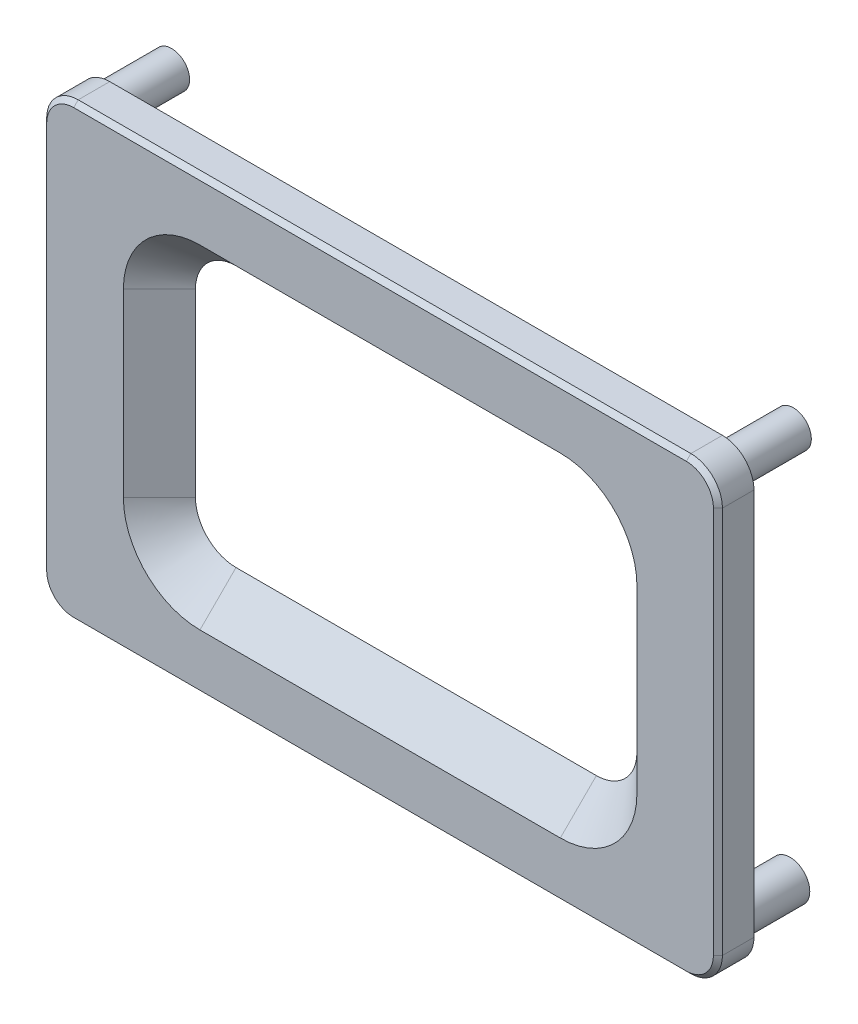
ISO-10303-21;
HEADER;
FILE_DESCRIPTION(('STEP AP214'),'2;1');
FILE_NAME('part.step','',(''),(''),'','','');
FILE_SCHEMA(('AUTOMOTIVE_DESIGN { 1 0 10303 214 1 1 1 1 }'));
ENDSEC;
DATA;
#1=APPLICATION_CONTEXT('core data for automotive mechanical design processes');
#2=APPLICATION_PROTOCOL_DEFINITION('international standard','automotive_design',2000,#1);
#3=PRODUCT_CONTEXT('',#1,'mechanical');
#4=PRODUCT('Part','Part','',(#3));
#5=PRODUCT_RELATED_PRODUCT_CATEGORY('part','',(#4));
#6=PRODUCT_DEFINITION_FORMATION('','',#4);
#7=PRODUCT_DEFINITION_CONTEXT('part definition',#1,'design');
#8=PRODUCT_DEFINITION('design','',#6,#7);
#9=PRODUCT_DEFINITION_SHAPE('','',#8);
#10=(LENGTH_UNIT() NAMED_UNIT(*) SI_UNIT(.MILLI.,.METRE.));
#11=(NAMED_UNIT(*) PLANE_ANGLE_UNIT() SI_UNIT($,.RADIAN.));
#12=(NAMED_UNIT(*) SI_UNIT($,.STERADIAN.) SOLID_ANGLE_UNIT());
#13=UNCERTAINTY_MEASURE_WITH_UNIT(LENGTH_MEASURE(1.E-05),#10,'distance_accuracy_value','');
#14=(GEOMETRIC_REPRESENTATION_CONTEXT(3) GLOBAL_UNCERTAINTY_ASSIGNED_CONTEXT((#13)) GLOBAL_UNIT_ASSIGNED_CONTEXT((#10,
#11,#12)) REPRESENTATION_CONTEXT('',''));
#15=CARTESIAN_POINT('',(0.,0.,0.));
#16=DIRECTION('',(0.,0.,1.));
#17=DIRECTION('',(1.,0.,0.));
#18=AXIS2_PLACEMENT_3D('',#15,#16,#17);
#19=CARTESIAN_POINT('',(-44.3202666293892,-39.7352999580629,8.));
#20=DIRECTION('',(0.,0.,-1.));
#21=DIRECTION('',(-1.,0.,0.));
#22=AXIS2_PLACEMENT_3D('',#19,#20,#21);
#23=CYLINDRICAL_SURFACE('',#22,7.);
#24=DIRECTION('',(0.,0.,-1.));
#25=VECTOR('',#24,1.);
#26=CARTESIAN_POINT('',(-44.3202666293892,-46.7352999580629,8.));
#27=LINE('',#26,#25);
#28=CARTESIAN_POINT('',(-44.3202666293892,-46.7352999580629,7.));
#29=VERTEX_POINT('',#28);
#30=CARTESIAN_POINT('',(-44.3202666293892,-46.7352999580629,0.));
#31=VERTEX_POINT('',#30);
#32=EDGE_CURVE('E175',#29,#31,#27,.T.);
#33=ORIENTED_EDGE('',*,*,#32,.F.);
#34=CARTESIAN_POINT('',(-44.3202666293892,-39.7352999580629,7.));
#35=DIRECTION('',(0.,0.,1.));
#36=DIRECTION('',(1.,0.,0.));
#37=AXIS2_PLACEMENT_3D('',#34,#35,#36);
#38=CIRCLE('',#37,7.);
#39=CARTESIAN_POINT('',(-51.3202666293892,-39.7352999580628,7.));
#40=VERTEX_POINT('',#39);
#41=EDGE_CURVE('E254',#29,#40,#38,.F.);
#42=ORIENTED_EDGE('',*,*,#41,.T.);
#43=DIRECTION('',(0.,0.,-1.));
#44=VECTOR('',#43,1.);
#45=CARTESIAN_POINT('',(-51.3202666293892,-39.7352999580628,8.));
#46=LINE('',#45,#44);
#47=CARTESIAN_POINT('',(-51.3202666293892,-39.7352999580628,0.));
#48=VERTEX_POINT('',#47);
#49=EDGE_CURVE('E200',#40,#48,#46,.T.);
#50=ORIENTED_EDGE('',*,*,#49,.T.);
#51=CARTESIAN_POINT('',(-44.3202666293892,-39.7352999580629,0.));
#52=DIRECTION('',(0.,0.,1.));
#53=DIRECTION('',(1.,0.,0.));
#54=AXIS2_PLACEMENT_3D('',#51,#52,#53);
#55=CIRCLE('',#54,7.);
#56=EDGE_CURVE('E194',#48,#31,#55,.T.);
#57=ORIENTED_EDGE('',*,*,#56,.T.);
#58=EDGE_LOOP('',(#33,#42,#50,#57));
#59=FACE_BOUND('',#58,.T.);
#60=ADVANCED_FACE('F37',(#59),#23,.T.);
#61=CARTESIAN_POINT('',(-44.3202666293892,-46.7352999580629,8.));
#62=DIRECTION('',(0.,1.,0.));
#63=DIRECTION('',(0.,0.,1.));
#64=AXIS2_PLACEMENT_3D('',#61,#62,#63);
#65=PLANE('',#64);
#66=DIRECTION('',(0.,0.,-1.));
#67=VECTOR('',#66,1.);
#68=CARTESIAN_POINT('',(91.6797333706107,-46.7352999580629,8.));
#69=LINE('',#68,#67);
#70=CARTESIAN_POINT('',(91.6797333706107,-46.7352999580629,7.));
#71=VERTEX_POINT('',#70);
#72=CARTESIAN_POINT('',(91.6797333706107,-46.7352999580629,0.));
#73=VERTEX_POINT('',#72);
#74=EDGE_CURVE('E188',#71,#73,#69,.T.);
#75=ORIENTED_EDGE('',*,*,#74,.F.);
#76=DIRECTION('',(-1.,0.,0.));
#77=VECTOR('',#76,1.);
#78=CARTESIAN_POINT('',(-44.3202666293892,-46.7352999580629,7.));
#79=LINE('',#78,#77);
#80=EDGE_CURVE('E182',#71,#29,#79,.T.);
#81=ORIENTED_EDGE('',*,*,#80,.T.);
#82=ORIENTED_EDGE('',*,*,#32,.T.);
#83=DIRECTION('',(1.,0.,0.));
#84=VECTOR('',#83,1.);
#85=CARTESIAN_POINT('',(-44.3202666293892,-46.7352999580629,0.));
#86=LINE('',#85,#84);
#87=EDGE_CURVE('E179',#31,#73,#86,.T.);
#88=ORIENTED_EDGE('',*,*,#87,.T.);
#89=EDGE_LOOP('',(#75,#81,#82,#88));
#90=FACE_BOUND('',#89,.T.);
#91=ADVANCED_FACE('F178',(#90),#65,.F.);
#92=CARTESIAN_POINT('',(91.6797333706107,-39.7352999580629,8.));
#93=DIRECTION('',(0.,0.,-1.));
#94=DIRECTION('',(-1.,0.,0.));
#95=AXIS2_PLACEMENT_3D('',#92,#93,#94);
#96=CYLINDRICAL_SURFACE('',#95,7.);
#97=DIRECTION('',(0.,0.,-1.));
#98=VECTOR('',#97,1.);
#99=CARTESIAN_POINT('',(98.6797333706107,-39.7352999580628,8.));
#100=LINE('',#99,#98);
#101=CARTESIAN_POINT('',(98.6797333706107,-39.7352999580628,7.));
#102=VERTEX_POINT('',#101);
#103=CARTESIAN_POINT('',(98.6797333706107,-39.7352999580628,0.));
#104=VERTEX_POINT('',#103);
#105=EDGE_CURVE('E235',#102,#104,#100,.T.);
#106=ORIENTED_EDGE('',*,*,#105,.F.);
#107=CARTESIAN_POINT('',(91.6797333706107,-39.7352999580629,7.));
#108=DIRECTION('',(0.,0.,1.));
#109=DIRECTION('',(1.,0.,0.));
#110=AXIS2_PLACEMENT_3D('',#107,#108,#109);
#111=CIRCLE('',#110,7.);
#112=EDGE_CURVE('E257',#102,#71,#111,.F.);
#113=ORIENTED_EDGE('',*,*,#112,.T.);
#114=ORIENTED_EDGE('',*,*,#74,.T.);
#115=CARTESIAN_POINT('',(91.6797333706107,-39.7352999580629,0.));
#116=DIRECTION('',(0.,0.,1.));
#117=DIRECTION('',(1.,0.,0.));
#118=AXIS2_PLACEMENT_3D('',#115,#116,#117);
#119=CIRCLE('',#118,7.);
#120=EDGE_CURVE('E197',#73,#104,#119,.T.);
#121=ORIENTED_EDGE('',*,*,#120,.T.);
#122=EDGE_LOOP('',(#106,#113,#114,#121));
#123=FACE_BOUND('',#122,.T.);
#124=ADVANCED_FACE('F414',(#123),#96,.T.);
#125=CARTESIAN_POINT('',(98.6797333706107,46.2647000419371,8.));
#126=DIRECTION('',(-1.,0.,0.));
#127=DIRECTION('',(0.,-1.,0.));
#128=AXIS2_PLACEMENT_3D('',#125,#126,#127);
#129=PLANE('',#128);
#130=DIRECTION('',(0.,0.,-1.));
#131=VECTOR('',#130,1.);
#132=CARTESIAN_POINT('',(98.6797333706107,46.2647000419371,8.));
#133=LINE('',#132,#131);
#134=CARTESIAN_POINT('',(98.6797333706107,46.2647000419371,7.));
#135=VERTEX_POINT('',#134);
#136=CARTESIAN_POINT('',(98.6797333706107,46.2647000419371,0.));
#137=VERTEX_POINT('',#136);
#138=EDGE_CURVE('E233',#135,#137,#133,.T.);
#139=ORIENTED_EDGE('',*,*,#138,.F.);
#140=DIRECTION('',(0.,-1.,0.));
#141=VECTOR('',#140,1.);
#142=CARTESIAN_POINT('',(98.6797333706107,-39.7352999580628,7.));
#143=LINE('',#142,#141);
#144=EDGE_CURVE('E259',#135,#102,#143,.T.);
#145=ORIENTED_EDGE('',*,*,#144,.T.);
#146=ORIENTED_EDGE('',*,*,#105,.T.);
#147=DIRECTION('',(0.,1.,0.));
#148=VECTOR('',#147,1.);
#149=CARTESIAN_POINT('',(98.6797333706107,46.2647000419371,0.));
#150=LINE('',#149,#148);
#151=EDGE_CURVE('E212',#104,#137,#150,.T.);
#152=ORIENTED_EDGE('',*,*,#151,.T.);
#153=EDGE_LOOP('',(#139,#145,#146,#152));
#154=FACE_BOUND('',#153,.T.);
#155=ADVANCED_FACE('F836',(#154),#129,.F.);
#156=CARTESIAN_POINT('',(91.6797333706107,46.2647000419371,8.));
#157=DIRECTION('',(0.,0.,-1.));
#158=DIRECTION('',(-1.,0.,0.));
#159=AXIS2_PLACEMENT_3D('',#156,#157,#158);
#160=CYLINDRICAL_SURFACE('',#159,7.);
#161=DIRECTION('',(0.,0.,-1.));
#162=VECTOR('',#161,1.);
#163=CARTESIAN_POINT('',(91.6797333706107,53.2647000419371,8.));
#164=LINE('',#163,#162);
#165=CARTESIAN_POINT('',(91.6797333706107,53.2647000419371,7.));
#166=VERTEX_POINT('',#165);
#167=CARTESIAN_POINT('',(91.6797333706107,53.2647000419371,0.));
#168=VERTEX_POINT('',#167);
#169=EDGE_CURVE('E231',#166,#168,#164,.T.);
#170=ORIENTED_EDGE('',*,*,#169,.F.);
#171=CARTESIAN_POINT('',(91.6797333706107,46.2647000419371,7.));
#172=DIRECTION('',(0.,0.,1.));
#173=DIRECTION('',(1.,0.,0.));
#174=AXIS2_PLACEMENT_3D('',#171,#172,#173);
#175=CIRCLE('',#174,7.);
#176=EDGE_CURVE('E261',#166,#135,#175,.F.);
#177=ORIENTED_EDGE('',*,*,#176,.T.);
#178=ORIENTED_EDGE('',*,*,#138,.T.);
#179=CARTESIAN_POINT('',(91.6797333706107,46.2647000419371,0.));
#180=DIRECTION('',(0.,0.,1.));
#181=DIRECTION('',(-1.,0.,0.));
#182=AXIS2_PLACEMENT_3D('',#179,#180,#181);
#183=CIRCLE('',#182,7.);
#184=EDGE_CURVE('E215',#137,#168,#183,.T.);
#185=ORIENTED_EDGE('',*,*,#184,.T.);
#186=EDGE_LOOP('',(#170,#177,#178,#185));
#187=FACE_BOUND('',#186,.T.);
#188=ADVANCED_FACE('F826',(#187),#160,.T.);
#189=CARTESIAN_POINT('',(-44.3202666293892,53.2647000419371,8.));
#190=DIRECTION('',(0.,-1.,0.));
#191=DIRECTION('',(0.,0.,-1.));
#192=AXIS2_PLACEMENT_3D('',#189,#190,#191);
#193=PLANE('',#192);
#194=DIRECTION('',(0.,0.,-1.));
#195=VECTOR('',#194,1.);
#196=CARTESIAN_POINT('',(-44.3202666293892,53.2647000419371,8.));
#197=LINE('',#196,#195);
#198=CARTESIAN_POINT('',(-44.3202666293892,53.2647000419371,7.));
#199=VERTEX_POINT('',#198);
#200=CARTESIAN_POINT('',(-44.3202666293892,53.2647000419371,0.));
#201=VERTEX_POINT('',#200);
#202=EDGE_CURVE('E229',#199,#201,#197,.T.);
#203=ORIENTED_EDGE('',*,*,#202,.F.);
#204=DIRECTION('',(1.,0.,0.));
#205=VECTOR('',#204,1.);
#206=CARTESIAN_POINT('',(91.6797333706107,53.2647000419371,7.));
#207=LINE('',#206,#205);
#208=EDGE_CURVE('E263',#199,#166,#207,.T.);
#209=ORIENTED_EDGE('',*,*,#208,.T.);
#210=ORIENTED_EDGE('',*,*,#169,.T.);
#211=DIRECTION('',(-1.,0.,0.));
#212=VECTOR('',#211,1.);
#213=CARTESIAN_POINT('',(-44.3202666293892,53.2647000419371,0.));
#214=LINE('',#213,#212);
#215=EDGE_CURVE('E218',#168,#201,#214,.T.);
#216=ORIENTED_EDGE('',*,*,#215,.T.);
#217=EDGE_LOOP('',(#203,#209,#210,#216));
#218=FACE_BOUND('',#217,.T.);
#219=ADVANCED_FACE('F816',(#218),#193,.F.);
#220=CARTESIAN_POINT('',(-44.3202666293892,46.2647000419371,8.));
#221=DIRECTION('',(0.,0.,-1.));
#222=DIRECTION('',(-1.,0.,0.));
#223=AXIS2_PLACEMENT_3D('',#220,#221,#222);
#224=CYLINDRICAL_SURFACE('',#223,7.);
#225=DIRECTION('',(0.,0.,-1.));
#226=VECTOR('',#225,1.);
#227=CARTESIAN_POINT('',(-51.3202666293892,46.2647000419371,8.));
#228=LINE('',#227,#226);
#229=CARTESIAN_POINT('',(-51.3202666293892,46.2647000419371,7.));
#230=VERTEX_POINT('',#229);
#231=CARTESIAN_POINT('',(-51.3202666293892,46.2647000419371,0.));
#232=VERTEX_POINT('',#231);
#233=EDGE_CURVE('E227',#230,#232,#228,.T.);
#234=ORIENTED_EDGE('',*,*,#233,.F.);
#235=CARTESIAN_POINT('',(-44.3202666293892,46.2647000419371,7.));
#236=DIRECTION('',(0.,0.,1.));
#237=DIRECTION('',(1.,0.,0.));
#238=AXIS2_PLACEMENT_3D('',#235,#236,#237);
#239=CIRCLE('',#238,7.);
#240=EDGE_CURVE('E265',#230,#199,#239,.F.);
#241=ORIENTED_EDGE('',*,*,#240,.T.);
#242=ORIENTED_EDGE('',*,*,#202,.T.);
#243=CARTESIAN_POINT('',(-44.3202666293892,46.2647000419371,0.));
#244=DIRECTION('',(0.,0.,1.));
#245=DIRECTION('',(1.,0.,0.));
#246=AXIS2_PLACEMENT_3D('',#243,#244,#245);
#247=CIRCLE('',#246,7.);
#248=EDGE_CURVE('E221',#201,#232,#247,.T.);
#249=ORIENTED_EDGE('',*,*,#248,.T.);
#250=EDGE_LOOP('',(#234,#241,#242,#249));
#251=FACE_BOUND('',#250,.T.);
#252=ADVANCED_FACE('F806',(#251),#224,.T.);
#253=CARTESIAN_POINT('',(-51.3202666293892,46.2647000419371,8.));
#254=DIRECTION('',(1.,0.,0.));
#255=DIRECTION('',(0.,1.,0.));
#256=AXIS2_PLACEMENT_3D('',#253,#254,#255);
#257=PLANE('',#256);
#258=ORIENTED_EDGE('',*,*,#49,.F.);
#259=DIRECTION('',(0.,1.,0.));
#260=VECTOR('',#259,1.);
#261=CARTESIAN_POINT('',(-51.3202666293892,46.2647000419371,7.));
#262=LINE('',#261,#260);
#263=EDGE_CURVE('E267',#40,#230,#262,.T.);
#264=ORIENTED_EDGE('',*,*,#263,.T.);
#265=ORIENTED_EDGE('',*,*,#233,.T.);
#266=DIRECTION('',(0.,-1.,0.));
#267=VECTOR('',#266,1.);
#268=CARTESIAN_POINT('',(-51.3202666293892,46.2647000419371,0.));
#269=LINE('',#268,#267);
#270=EDGE_CURVE('E224',#232,#48,#269,.T.);
#271=ORIENTED_EDGE('',*,*,#270,.T.);
#272=EDGE_LOOP('',(#258,#264,#265,#271));
#273=FACE_BOUND('',#272,.T.);
#274=ADVANCED_FACE('F615',(#273),#257,.F.);
#275=CARTESIAN_POINT('',(-44.3202666293892,-39.7352999580629,8.));
#276=DIRECTION('',(0.,0.,1.));
#277=DIRECTION('',(1.,0.,0.));
#278=AXIS2_PLACEMENT_3D('',#275,#276,#277);
#279=PLANE('',#278);
#280=CARTESIAN_POINT('',(63.7049259572197,-17.1350713965489,8.));
#281=DIRECTION('',(0.,0.,1.));
#282=DIRECTION('',(1.,0.,0.));
#283=AXIS2_PLACEMENT_3D('',#280,#281,#282);
#284=CIRCLE('',#283,17.0000000000001);
#285=CARTESIAN_POINT('',(80.7049259572198,-17.1350713965489,8.));
#286=VERTEX_POINT('',#285);
#287=CARTESIAN_POINT('',(63.7049259572196,-34.135071396549,8.));
#288=VERTEX_POINT('',#287);
#289=EDGE_CURVE('E47',#286,#288,#284,.F.);
#290=ORIENTED_EDGE('',*,*,#289,.T.);
#291=DIRECTION('',(-1.,0.,0.));
#292=VECTOR('',#291,1.);
#293=CARTESIAN_POINT('',(-16.2950740427802,-34.135071396549,8.));
#294=LINE('',#293,#292);
#295=CARTESIAN_POINT('',(-16.2950740427801,-34.135071396549,8.));
#296=VERTEX_POINT('',#295);
#297=EDGE_CURVE('E11',#288,#296,#294,.T.);
#298=ORIENTED_EDGE('',*,*,#297,.T.);
#299=CARTESIAN_POINT('',(-16.2950740427803,-17.1350713965489,8.));
#300=DIRECTION('',(0.,0.,1.));
#301=DIRECTION('',(1.,0.,0.));
#302=AXIS2_PLACEMENT_3D('',#299,#300,#301);
#303=CIRCLE('',#302,17.0000000000001);
#304=CARTESIAN_POINT('',(-33.2950740427803,-17.1350713965489,8.));
#305=VERTEX_POINT('',#304);
#306=EDGE_CURVE('E322',#296,#305,#303,.F.);
#307=ORIENTED_EDGE('',*,*,#306,.T.);
#308=DIRECTION('',(0.,1.,0.));
#309=VECTOR('',#308,1.);
#310=CARTESIAN_POINT('',(-33.2950740427803,22.864928603451,8.));
#311=LINE('',#310,#309);
#312=CARTESIAN_POINT('',(-33.2950740427803,22.8649286034509,8.));
#313=VERTEX_POINT('',#312);
#314=EDGE_CURVE('E320',#305,#313,#311,.T.);
#315=ORIENTED_EDGE('',*,*,#314,.T.);
#316=CARTESIAN_POINT('',(-16.2950740427803,22.8649286034511,8.));
#317=DIRECTION('',(0.,0.,1.));
#318=DIRECTION('',(1.,0.,0.));
#319=AXIS2_PLACEMENT_3D('',#316,#317,#318);
#320=CIRCLE('',#319,17.0000000000001);
#321=CARTESIAN_POINT('',(-16.2950740427802,39.8649286034511,8.));
#322=VERTEX_POINT('',#321);
#323=EDGE_CURVE('E318',#313,#322,#320,.F.);
#324=ORIENTED_EDGE('',*,*,#323,.T.);
#325=DIRECTION('',(1.,0.,0.));
#326=VECTOR('',#325,1.);
#327=CARTESIAN_POINT('',(63.7049259572197,39.8649286034511,8.));
#328=LINE('',#327,#326);
#329=CARTESIAN_POINT('',(63.7049259572197,39.8649286034511,8.));
#330=VERTEX_POINT('',#329);
#331=EDGE_CURVE('E316',#322,#330,#328,.T.);
#332=ORIENTED_EDGE('',*,*,#331,.T.);
#333=CARTESIAN_POINT('',(63.7049259572197,22.8649286034511,8.));
#334=DIRECTION('',(0.,0.,1.));
#335=DIRECTION('',(1.,0.,0.));
#336=AXIS2_PLACEMENT_3D('',#333,#334,#335);
#337=CIRCLE('',#336,17.0000000000001);
#338=CARTESIAN_POINT('',(80.7049259572198,22.8649286034509,8.));
#339=VERTEX_POINT('',#338);
#340=EDGE_CURVE('E324',#330,#339,#337,.F.);
#341=ORIENTED_EDGE('',*,*,#340,.T.);
#342=DIRECTION('',(0.,-1.,0.));
#343=VECTOR('',#342,1.);
#344=CARTESIAN_POINT('',(80.7049259572198,-17.1350713965489,8.));
#345=LINE('',#344,#343);
#346=EDGE_CURVE('E58',#339,#286,#345,.T.);
#347=ORIENTED_EDGE('',*,*,#346,.T.);
#348=EDGE_LOOP('',(#290,#298,#307,#315,#324,#332,#341,#347));
#349=FACE_BOUND('',#348,.T.);
#350=DIRECTION('',(0.,-1.,0.));
#351=VECTOR('',#350,1.);
#352=CARTESIAN_POINT('',(-50.3202666293892,-39.7352999580628,8.));
#353=LINE('',#352,#351);
#354=CARTESIAN_POINT('',(-50.3202666293892,46.2647000419371,8.));
#355=VERTEX_POINT('',#354);
#356=CARTESIAN_POINT('',(-50.3202666293892,-39.7352999580628,8.));
#357=VERTEX_POINT('',#356);
#358=EDGE_CURVE('E187',#355,#357,#353,.T.);
#359=ORIENTED_EDGE('',*,*,#358,.T.);
#360=CARTESIAN_POINT('',(-44.3202666293892,-39.7352999580629,8.));
#361=DIRECTION('',(0.,0.,1.));
#362=DIRECTION('',(1.,0.,0.));
#363=AXIS2_PLACEMENT_3D('',#360,#361,#362);
#364=CIRCLE('',#363,6.);
#365=CARTESIAN_POINT('',(-44.3202666293892,-45.7352999580629,8.));
#366=VERTEX_POINT('',#365);
#367=EDGE_CURVE('E251',#357,#366,#364,.T.);
#368=ORIENTED_EDGE('',*,*,#367,.T.);
#369=DIRECTION('',(1.,0.,0.));
#370=VECTOR('',#369,1.);
#371=CARTESIAN_POINT('',(91.6797333706107,-45.7352999580629,8.));
#372=LINE('',#371,#370);
#373=CARTESIAN_POINT('',(91.6797333706107,-45.7352999580629,8.));
#374=VERTEX_POINT('',#373);
#375=EDGE_CURVE('E249',#366,#374,#372,.T.);
#376=ORIENTED_EDGE('',*,*,#375,.T.);
#377=CARTESIAN_POINT('',(91.6797333706107,-39.7352999580629,8.));
#378=DIRECTION('',(0.,0.,1.));
#379=DIRECTION('',(1.,0.,0.));
#380=AXIS2_PLACEMENT_3D('',#377,#378,#379);
#381=CIRCLE('',#380,6.00000000000001);
#382=CARTESIAN_POINT('',(97.6797333706108,-39.7352999580628,8.));
#383=VERTEX_POINT('',#382);
#384=EDGE_CURVE('E247',#374,#383,#381,.T.);
#385=ORIENTED_EDGE('',*,*,#384,.T.);
#386=DIRECTION('',(0.,1.,0.));
#387=VECTOR('',#386,1.);
#388=CARTESIAN_POINT('',(97.6797333706107,46.2647000419371,8.));
#389=LINE('',#388,#387);
#390=CARTESIAN_POINT('',(97.6797333706107,46.2647000419371,8.));
#391=VERTEX_POINT('',#390);
#392=EDGE_CURVE('E245',#383,#391,#389,.T.);
#393=ORIENTED_EDGE('',*,*,#392,.T.);
#394=CARTESIAN_POINT('',(91.6797333706107,46.2647000419371,8.));
#395=DIRECTION('',(0.,0.,1.));
#396=DIRECTION('',(1.,0.,0.));
#397=AXIS2_PLACEMENT_3D('',#394,#395,#396);
#398=CIRCLE('',#397,6.);
#399=CARTESIAN_POINT('',(91.6797333706107,52.2647000419371,8.));
#400=VERTEX_POINT('',#399);
#401=EDGE_CURVE('E243',#391,#400,#398,.T.);
#402=ORIENTED_EDGE('',*,*,#401,.T.);
#403=DIRECTION('',(-1.,0.,0.));
#404=VECTOR('',#403,1.);
#405=CARTESIAN_POINT('',(-44.3202666293892,52.2647000419371,8.));
#406=LINE('',#405,#404);
#407=CARTESIAN_POINT('',(-44.3202666293892,52.2647000419371,8.));
#408=VERTEX_POINT('',#407);
#409=EDGE_CURVE('E241',#400,#408,#406,.T.);
#410=ORIENTED_EDGE('',*,*,#409,.T.);
#411=CARTESIAN_POINT('',(-44.3202666293892,46.2647000419371,8.));
#412=DIRECTION('',(0.,0.,1.));
#413=DIRECTION('',(1.,0.,0.));
#414=AXIS2_PLACEMENT_3D('',#411,#412,#413);
#415=CIRCLE('',#414,6.);
#416=EDGE_CURVE('E239',#408,#355,#415,.T.);
#417=ORIENTED_EDGE('',*,*,#416,.T.);
#418=EDGE_LOOP('',(#359,#368,#376,#385,#393,#402,#410,#417));
#419=FACE_BOUND('',#418,.T.);
#420=ADVANCED_FACE('F532',(#349,#419),#279,.T.);
#421=CARTESIAN_POINT('',(-44.3202666293892,-39.7352999580629,0.));
#422=DIRECTION('',(0.,0.,1.));
#423=DIRECTION('',(1.,0.,0.));
#424=AXIS2_PLACEMENT_3D('',#421,#422,#423);
#425=PLANE('',#424);
#426=CARTESIAN_POINT('',(-16.2950740427803,-17.1350713965489,0.));
#427=DIRECTION('',(0.,0.,1.));
#428=DIRECTION('',(1.,0.,0.));
#429=AXIS2_PLACEMENT_3D('',#426,#427,#428);
#430=CIRCLE('',#429,9.00000000000015);
#431=CARTESIAN_POINT('',(-25.2950740427804,-17.1350713965489,0.));
#432=VERTEX_POINT('',#431);
#433=CARTESIAN_POINT('',(-16.2950740427802,-26.1350713965491,0.));
#434=VERTEX_POINT('',#433);
#435=EDGE_CURVE('E305',#432,#434,#430,.T.);
#436=ORIENTED_EDGE('',*,*,#435,.T.);
#437=DIRECTION('',(1.,0.,0.));
#438=VECTOR('',#437,1.);
#439=CARTESIAN_POINT('',(-16.2950740427802,-26.1350713965491,0.));
#440=LINE('',#439,#438);
#441=CARTESIAN_POINT('',(63.7049259572197,-26.1350713965491,0.));
#442=VERTEX_POINT('',#441);
#443=EDGE_CURVE('E313',#434,#442,#440,.T.);
#444=ORIENTED_EDGE('',*,*,#443,.T.);
#445=CARTESIAN_POINT('',(63.7049259572197,-17.1350713965489,0.));
#446=DIRECTION('',(0.,0.,1.));
#447=DIRECTION('',(1.,0.,0.));
#448=AXIS2_PLACEMENT_3D('',#445,#446,#447);
#449=CIRCLE('',#448,9.00000000000016);
#450=CARTESIAN_POINT('',(72.7049259572199,-17.1350713965489,0.));
#451=VERTEX_POINT('',#450);
#452=EDGE_CURVE('E311',#442,#451,#449,.T.);
#453=ORIENTED_EDGE('',*,*,#452,.T.);
#454=DIRECTION('',(0.,1.,0.));
#455=VECTOR('',#454,1.);
#456=CARTESIAN_POINT('',(72.7049259572199,22.864928603451,0.));
#457=LINE('',#456,#455);
#458=CARTESIAN_POINT('',(72.7049259572199,22.864928603451,0.));
#459=VERTEX_POINT('',#458);
#460=EDGE_CURVE('E309',#451,#459,#457,.T.);
#461=ORIENTED_EDGE('',*,*,#460,.T.);
#462=CARTESIAN_POINT('',(63.7049259572197,22.8649286034511,0.));
#463=DIRECTION('',(0.,0.,1.));
#464=DIRECTION('',(1.,0.,0.));
#465=AXIS2_PLACEMENT_3D('',#462,#463,#464);
#466=CIRCLE('',#465,9.00000000000016);
#467=CARTESIAN_POINT('',(63.7049259572197,31.8649286034512,0.));
#468=VERTEX_POINT('',#467);
#469=EDGE_CURVE('E307',#459,#468,#466,.T.);
#470=ORIENTED_EDGE('',*,*,#469,.T.);
#471=DIRECTION('',(-1.,0.,0.));
#472=VECTOR('',#471,1.);
#473=CARTESIAN_POINT('',(-16.2950740427802,31.8649286034512,0.));
#474=LINE('',#473,#472);
#475=CARTESIAN_POINT('',(-16.2950740427802,31.8649286034512,0.));
#476=VERTEX_POINT('',#475);
#477=EDGE_CURVE('E299',#468,#476,#474,.T.);
#478=ORIENTED_EDGE('',*,*,#477,.T.);
#479=CARTESIAN_POINT('',(-16.2950740427803,22.8649286034511,0.));
#480=DIRECTION('',(0.,0.,1.));
#481=DIRECTION('',(1.,0.,0.));
#482=AXIS2_PLACEMENT_3D('',#479,#480,#481);
#483=CIRCLE('',#482,9.00000000000015);
#484=CARTESIAN_POINT('',(-25.2950740427804,22.864928603451,0.));
#485=VERTEX_POINT('',#484);
#486=EDGE_CURVE('E301',#476,#485,#483,.T.);
#487=ORIENTED_EDGE('',*,*,#486,.T.);
#488=DIRECTION('',(0.,-1.,0.));
#489=VECTOR('',#488,1.);
#490=CARTESIAN_POINT('',(-25.2950740427804,22.864928603451,0.));
#491=LINE('',#490,#489);
#492=EDGE_CURVE('E303',#485,#432,#491,.T.);
#493=ORIENTED_EDGE('',*,*,#492,.T.);
#494=EDGE_LOOP('',(#436,#444,#453,#461,#470,#478,#487,#493));
#495=FACE_BOUND('',#494,.T.);
#496=CARTESIAN_POINT('',(-42.7197932332828,-38.5359314123874,0.));
#497=DIRECTION('',(0.,0.,1.));
#498=DIRECTION('',(1.,0.,0.));
#499=AXIS2_PLACEMENT_3D('',#496,#497,#498);
#500=CIRCLE('',#499,4.00000000000001);
#501=CARTESIAN_POINT('',(-38.7197932332828,-38.5359314123874,0.));
#502=VERTEX_POINT('',#501);
#503=EDGE_CURVE('E296',#502,#502,#500,.F.);
#504=ORIENTED_EDGE('',*,*,#503,.F.);
#505=EDGE_LOOP('',(#504));
#506=FACE_BOUND('',#505,.T.);
#507=CARTESIAN_POINT('',(-45.5965699248782,47.5002406717007,0.));
#508=DIRECTION('',(0.,0.,1.));
#509=DIRECTION('',(1.,0.,0.));
#510=AXIS2_PLACEMENT_3D('',#507,#508,#509);
#511=CIRCLE('',#510,4.00000000000001);
#512=CARTESIAN_POINT('',(-41.5965699248782,47.5002406717007,0.));
#513=VERTEX_POINT('',#512);
#514=EDGE_CURVE('E293',#513,#513,#511,.F.);
#515=ORIENTED_EDGE('',*,*,#514,.F.);
#516=EDGE_LOOP('',(#515));
#517=FACE_BOUND('',#516,.T.);
#518=CARTESIAN_POINT('',(91.6797333706107,-39.7352999580629,0.));
#519=DIRECTION('',(0.,0.,1.));
#520=DIRECTION('',(1.,0.,0.));
#521=AXIS2_PLACEMENT_3D('',#518,#519,#520);
#522=CIRCLE('',#521,4.39639325779997);
#523=CARTESIAN_POINT('',(96.0761266284107,-39.7352999580629,0.));
#524=VERTEX_POINT('',#523);
#525=EDGE_CURVE('E290',#524,#524,#522,.F.);
#526=ORIENTED_EDGE('',*,*,#525,.F.);
#527=EDGE_LOOP('',(#526));
#528=FACE_BOUND('',#527,.T.);
#529=CARTESIAN_POINT('',(92.4172074288878,47.443208315928,0.));
#530=DIRECTION('',(0.,0.,1.));
#531=DIRECTION('',(1.,0.,0.));
#532=AXIS2_PLACEMENT_3D('',#529,#530,#531);
#533=CIRCLE('',#532,4.00000000000001);
#534=CARTESIAN_POINT('',(96.4172074288878,47.443208315928,0.));
#535=VERTEX_POINT('',#534);
#536=EDGE_CURVE('E269',#535,#535,#533,.F.);
#537=ORIENTED_EDGE('',*,*,#536,.F.);
#538=EDGE_LOOP('',(#537));
#539=FACE_BOUND('',#538,.T.);
#540=ORIENTED_EDGE('',*,*,#56,.F.);
#541=ORIENTED_EDGE('',*,*,#270,.F.);
#542=ORIENTED_EDGE('',*,*,#248,.F.);
#543=ORIENTED_EDGE('',*,*,#215,.F.);
#544=ORIENTED_EDGE('',*,*,#184,.F.);
#545=ORIENTED_EDGE('',*,*,#151,.F.);
#546=ORIENTED_EDGE('',*,*,#120,.F.);
#547=ORIENTED_EDGE('',*,*,#87,.F.);
#548=EDGE_LOOP('',(#540,#541,#542,#543,#544,#545,#546,#547));
#549=FACE_BOUND('',#548,.T.);
#550=ADVANCED_FACE('F192',(#495,#506,#517,#528,#539,#549),#425,.F.);
#551=CARTESIAN_POINT('',(91.6797333706107,46.2647000419371,8.));
#552=DIRECTION('',(0.,0.,-1.));
#553=DIRECTION('',(-1.,0.,0.));
#554=AXIS2_PLACEMENT_3D('',#551,#552,#553);
#555=CONICAL_SURFACE('',#554,6.,0.78539816339745);
#556=DIRECTION('',(-0.707106781186547,0.,0.707106781186547));
#557=VECTOR('',#556,1.);
#558=CARTESIAN_POINT('',(98.6797333706107,46.2647000419371,7.));
#559=LINE('',#558,#557);
#560=EDGE_CURVE('E205',#135,#391,#559,.T.);
#561=ORIENTED_EDGE('',*,*,#560,.F.);
#562=ORIENTED_EDGE('',*,*,#176,.F.);
#563=DIRECTION('',(0.,0.707106781186547,-0.707106781186547));
#564=VECTOR('',#563,1.);
#565=CARTESIAN_POINT('',(91.6797333706107,52.2647000419371,8.));
#566=LINE('',#565,#564);
#567=EDGE_CURVE('E202',#400,#166,#566,.T.);
#568=ORIENTED_EDGE('',*,*,#567,.F.);
#569=ORIENTED_EDGE('',*,*,#401,.F.);
#570=EDGE_LOOP('',(#561,#562,#568,#569));
#571=FACE_BOUND('',#570,.T.);
#572=ADVANCED_FACE('F467',(#571),#555,.T.);
#573=CARTESIAN_POINT('',(-44.3202666293892,52.2647000419371,8.));
#574=DIRECTION('',(0.,0.707106781186545,0.70710678118655));
#575=DIRECTION('',(1.,0.,0.));
#576=AXIS2_PLACEMENT_3D('',#573,#574,#575);
#577=PLANE('',#576);
#578=ORIENTED_EDGE('',*,*,#567,.T.);
#579=ORIENTED_EDGE('',*,*,#208,.F.);
#580=DIRECTION('',(0.,0.70710678118655,-0.707106781186545));
#581=VECTOR('',#580,1.);
#582=CARTESIAN_POINT('',(-44.3202666293892,52.2647000419371,8.));
#583=LINE('',#582,#581);
#584=EDGE_CURVE('E283',#408,#199,#583,.T.);
#585=ORIENTED_EDGE('',*,*,#584,.F.);
#586=ORIENTED_EDGE('',*,*,#409,.F.);
#587=EDGE_LOOP('',(#578,#579,#585,#586));
#588=FACE_BOUND('',#587,.T.);
#589=ADVANCED_FACE('F460',(#588),#577,.T.);
#590=CARTESIAN_POINT('',(97.6797333706108,-39.7352999580629,8.));
#591=DIRECTION('',(0.707106781186552,0.,0.707106781186543));
#592=DIRECTION('',(0.,-1.,0.));
#593=AXIS2_PLACEMENT_3D('',#590,#591,#592);
#594=PLANE('',#593);
#595=ORIENTED_EDGE('',*,*,#560,.T.);
#596=ORIENTED_EDGE('',*,*,#392,.F.);
#597=DIRECTION('',(-0.707106781186543,0.,0.707106781186552));
#598=VECTOR('',#597,1.);
#599=CARTESIAN_POINT('',(98.6797333706107,-39.7352999580628,7.));
#600=LINE('',#599,#598);
#601=EDGE_CURVE('E280',#102,#383,#600,.T.);
#602=ORIENTED_EDGE('',*,*,#601,.F.);
#603=ORIENTED_EDGE('',*,*,#144,.F.);
#604=EDGE_LOOP('',(#595,#596,#602,#603));
#605=FACE_BOUND('',#604,.T.);
#606=ADVANCED_FACE('F453',(#605),#594,.T.);
#607=CARTESIAN_POINT('',(-44.3202666293892,46.2647000419371,8.));
#608=DIRECTION('',(0.,0.,-1.));
#609=DIRECTION('',(-1.,0.,0.));
#610=AXIS2_PLACEMENT_3D('',#607,#608,#609);
#611=CONICAL_SURFACE('',#610,6.,0.785398163397448);
#612=ORIENTED_EDGE('',*,*,#584,.T.);
#613=ORIENTED_EDGE('',*,*,#240,.F.);
#614=DIRECTION('',(-0.707106781186547,0.,-0.707106781186547));
#615=VECTOR('',#614,1.);
#616=CARTESIAN_POINT('',(-50.3202666293892,46.2647000419371,8.));
#617=LINE('',#616,#615);
#618=EDGE_CURVE('E277',#355,#230,#617,.T.);
#619=ORIENTED_EDGE('',*,*,#618,.F.);
#620=ORIENTED_EDGE('',*,*,#416,.F.);
#621=EDGE_LOOP('',(#612,#613,#619,#620));
#622=FACE_BOUND('',#621,.T.);
#623=ADVANCED_FACE('F446',(#622),#611,.T.);
#624=CARTESIAN_POINT('',(91.6797333706107,-39.7352999580629,8.));
#625=DIRECTION('',(0.,0.,-1.));
#626=DIRECTION('',(-1.,0.,0.));
#627=AXIS2_PLACEMENT_3D('',#624,#625,#626);
#628=CONICAL_SURFACE('',#627,6.00000000000001,0.785398163397447);
#629=ORIENTED_EDGE('',*,*,#601,.T.);
#630=ORIENTED_EDGE('',*,*,#384,.F.);
#631=DIRECTION('',(0.,0.707106781186545,0.70710678118655));
#632=VECTOR('',#631,1.);
#633=CARTESIAN_POINT('',(91.6797333706107,-46.7352999580629,7.));
#634=LINE('',#633,#632);
#635=EDGE_CURVE('E274',#71,#374,#634,.T.);
#636=ORIENTED_EDGE('',*,*,#635,.F.);
#637=ORIENTED_EDGE('',*,*,#112,.F.);
#638=EDGE_LOOP('',(#629,#630,#636,#637));
#639=FACE_BOUND('',#638,.T.);
#640=ADVANCED_FACE('F439',(#639),#628,.T.);
#641=CARTESIAN_POINT('',(-50.3202666293892,-39.7352999580629,8.));
#642=DIRECTION('',(-0.707106781186547,0.,0.707106781186547));
#643=DIRECTION('',(0.,1.,0.));
#644=AXIS2_PLACEMENT_3D('',#641,#642,#643);
#645=PLANE('',#644);
#646=ORIENTED_EDGE('',*,*,#618,.T.);
#647=ORIENTED_EDGE('',*,*,#263,.F.);
#648=DIRECTION('',(-0.707106781186547,0.,-0.707106781186547));
#649=VECTOR('',#648,1.);
#650=CARTESIAN_POINT('',(-50.3202666293892,-39.7352999580628,8.));
#651=LINE('',#650,#649);
#652=EDGE_CURVE('E272',#357,#40,#651,.T.);
#653=ORIENTED_EDGE('',*,*,#652,.F.);
#654=ORIENTED_EDGE('',*,*,#358,.F.);
#655=EDGE_LOOP('',(#646,#647,#653,#654));
#656=FACE_BOUND('',#655,.T.);
#657=ADVANCED_FACE('F432',(#656),#645,.T.);
#658=CARTESIAN_POINT('',(-44.3202666293892,-45.7352999580629,8.));
#659=DIRECTION('',(0.,-0.707106781186547,0.707106781186547));
#660=DIRECTION('',(-1.,0.,0.));
#661=AXIS2_PLACEMENT_3D('',#658,#659,#660);
#662=PLANE('',#661);
#663=ORIENTED_EDGE('',*,*,#635,.T.);
#664=ORIENTED_EDGE('',*,*,#375,.F.);
#665=DIRECTION('',(0.,0.707106781186547,0.707106781186547));
#666=VECTOR('',#665,1.);
#667=CARTESIAN_POINT('',(-44.3202666293892,-46.7352999580629,7.));
#668=LINE('',#667,#666);
#669=EDGE_CURVE('E270',#29,#366,#668,.T.);
#670=ORIENTED_EDGE('',*,*,#669,.F.);
#671=ORIENTED_EDGE('',*,*,#80,.F.);
#672=EDGE_LOOP('',(#663,#664,#670,#671));
#673=FACE_BOUND('',#672,.T.);
#674=ADVANCED_FACE('F425',(#673),#662,.T.);
#675=CARTESIAN_POINT('',(-44.3202666293892,-39.7352999580629,8.));
#676=DIRECTION('',(0.,0.,-1.));
#677=DIRECTION('',(-1.,0.,0.));
#678=AXIS2_PLACEMENT_3D('',#675,#676,#677);
#679=CONICAL_SURFACE('',#678,6.,0.785398163397448);
#680=ORIENTED_EDGE('',*,*,#652,.T.);
#681=ORIENTED_EDGE('',*,*,#41,.F.);
#682=ORIENTED_EDGE('',*,*,#669,.T.);
#683=ORIENTED_EDGE('',*,*,#367,.F.);
#684=EDGE_LOOP('',(#680,#681,#682,#683));
#685=FACE_BOUND('',#684,.T.);
#686=ADVANCED_FACE('F419',(#685),#679,.T.);
#687=CARTESIAN_POINT('',(92.4172074288878,47.443208315928,-15.));
#688=DIRECTION('',(0.,0.,-1.));
#689=DIRECTION('',(-1.,0.,0.));
#690=AXIS2_PLACEMENT_3D('',#687,#688,#689);
#691=PLANE('',#690);
#692=CARTESIAN_POINT('',(92.4172074288878,47.443208315928,-15.));
#693=DIRECTION('',(0.,0.,-1.));
#694=DIRECTION('',(-1.,0.,0.));
#695=AXIS2_PLACEMENT_3D('',#692,#693,#694);
#696=CIRCLE('',#695,4.00000000000001);
#697=CARTESIAN_POINT('',(88.4172074288878,47.443208315928,-15.));
#698=VERTEX_POINT('',#697);
#699=EDGE_CURVE('E208',#698,#698,#696,.T.);
#700=ORIENTED_EDGE('',*,*,#699,.T.);
#701=EDGE_LOOP('',(#700));
#702=FACE_BOUND('',#701,.T.);
#703=CARTESIAN_POINT('',(92.4172074288878,47.443208315928,-15.));
#704=DIRECTION('',(0.,0.,-1.));
#705=DIRECTION('',(-1.,0.,0.));
#706=AXIS2_PLACEMENT_3D('',#703,#704,#705);
#707=CIRCLE('',#706,2.);
#708=CARTESIAN_POINT('',(90.4172074288878,47.443208315928,-15.));
#709=VERTEX_POINT('',#708);
#710=EDGE_CURVE('E385',#709,#709,#707,.T.);
#711=ORIENTED_EDGE('',*,*,#710,.F.);
#712=EDGE_LOOP('',(#711));
#713=FACE_BOUND('',#712,.T.);
#714=ADVANCED_FACE('F404',(#702,#713),#691,.T.);
#715=CARTESIAN_POINT('',(92.4172074288878,47.443208315928,-15.));
#716=DIRECTION('',(0.,0.,1.));
#717=DIRECTION('',(1.,0.,0.));
#718=AXIS2_PLACEMENT_3D('',#715,#716,#717);
#719=CYLINDRICAL_SURFACE('',#718,4.00000000000001);
#720=ORIENTED_EDGE('',*,*,#699,.F.);
#721=EDGE_LOOP('',(#720));
#722=FACE_BOUND('',#721,.T.);
#723=ORIENTED_EDGE('',*,*,#536,.T.);
#724=EDGE_LOOP('',(#723));
#725=FACE_BOUND('',#724,.T.);
#726=ADVANCED_FACE('F394',(#722,#725),#719,.T.);
#727=CARTESIAN_POINT('',(92.4172074288878,47.443208315928,-15.));
#728=DIRECTION('',(0.,0.,1.));
#729=DIRECTION('',(1.,0.,0.));
#730=AXIS2_PLACEMENT_3D('',#727,#728,#729);
#731=CYLINDRICAL_SURFACE('',#730,2.);
#732=ORIENTED_EDGE('',*,*,#710,.T.);
#733=EDGE_LOOP('',(#732));
#734=FACE_BOUND('',#733,.T.);
#735=CARTESIAN_POINT('',(92.4172074288878,47.443208315928,0.));
#736=DIRECTION('',(0.,0.,-1.));
#737=DIRECTION('',(-1.,0.,0.));
#738=AXIS2_PLACEMENT_3D('',#735,#736,#737);
#739=CIRCLE('',#738,2.);
#740=CARTESIAN_POINT('',(90.4172074288878,47.443208315928,0.));
#741=VERTEX_POINT('',#740);
#742=EDGE_CURVE('E384',#741,#741,#739,.T.);
#743=ORIENTED_EDGE('',*,*,#742,.F.);
#744=EDGE_LOOP('',(#743));
#745=FACE_BOUND('',#744,.T.);
#746=ADVANCED_FACE('F392',(#734,#745),#731,.F.);
#747=ORIENTED_EDGE('',*,*,#742,.T.);
#748=EDGE_LOOP('',(#747));
#749=FACE_BOUND('',#748,.T.);
#750=ADVANCED_FACE('F390',(#749),#425,.F.);
#751=CARTESIAN_POINT('',(91.6797333706107,-39.7352999580629,-15.));
#752=DIRECTION('',(0.,0.,-1.));
#753=DIRECTION('',(-1.,0.,0.));
#754=AXIS2_PLACEMENT_3D('',#751,#752,#753);
#755=PLANE('',#754);
#756=CARTESIAN_POINT('',(91.6797333706107,-39.7352999580629,-15.));
#757=DIRECTION('',(0.,0.,-1.));
#758=DIRECTION('',(-1.,0.,0.));
#759=AXIS2_PLACEMENT_3D('',#756,#757,#758);
#760=CIRCLE('',#759,4.39639325779997);
#761=CARTESIAN_POINT('',(87.2833401128108,-39.7352999580629,-15.));
#762=VERTEX_POINT('',#761);
#763=EDGE_CURVE('E379',#762,#762,#760,.T.);
#764=ORIENTED_EDGE('',*,*,#763,.T.);
#765=EDGE_LOOP('',(#764));
#766=FACE_BOUND('',#765,.T.);
#767=CARTESIAN_POINT('',(91.6797333706107,-39.7352999580629,-15.));
#768=DIRECTION('',(0.,0.,-1.));
#769=DIRECTION('',(-1.,0.,0.));
#770=AXIS2_PLACEMENT_3D('',#767,#768,#769);
#771=CIRCLE('',#770,2.);
#772=CARTESIAN_POINT('',(89.6797333706107,-39.7352999580629,-15.));
#773=VERTEX_POINT('',#772);
#774=EDGE_CURVE('E376',#773,#773,#771,.T.);
#775=ORIENTED_EDGE('',*,*,#774,.F.);
#776=EDGE_LOOP('',(#775));
#777=FACE_BOUND('',#776,.T.);
#778=ADVANCED_FACE('F401',(#766,#777),#755,.T.);
#779=CARTESIAN_POINT('',(91.6797333706107,-39.7352999580629,-15.));
#780=DIRECTION('',(0.,0.,1.));
#781=DIRECTION('',(1.,0.,0.));
#782=AXIS2_PLACEMENT_3D('',#779,#780,#781);
#783=CYLINDRICAL_SURFACE('',#782,4.39639325779997);
#784=ORIENTED_EDGE('',*,*,#763,.F.);
#785=EDGE_LOOP('',(#784));
#786=FACE_BOUND('',#785,.T.);
#787=ORIENTED_EDGE('',*,*,#525,.T.);
#788=EDGE_LOOP('',(#787));
#789=FACE_BOUND('',#788,.T.);
#790=ADVANCED_FACE('F557',(#786,#789),#783,.T.);
#791=CARTESIAN_POINT('',(91.6797333706107,-39.7352999580629,-15.));
#792=DIRECTION('',(0.,0.,1.));
#793=DIRECTION('',(1.,0.,0.));
#794=AXIS2_PLACEMENT_3D('',#791,#792,#793);
#795=CYLINDRICAL_SURFACE('',#794,2.);
#796=ORIENTED_EDGE('',*,*,#774,.T.);
#797=EDGE_LOOP('',(#796));
#798=FACE_BOUND('',#797,.T.);
#799=CARTESIAN_POINT('',(91.6797333706107,-39.7352999580629,0.));
#800=DIRECTION('',(0.,0.,-1.));
#801=DIRECTION('',(-1.,0.,0.));
#802=AXIS2_PLACEMENT_3D('',#799,#800,#801);
#803=CIRCLE('',#802,2.);
#804=CARTESIAN_POINT('',(89.6797333706107,-39.7352999580629,0.));
#805=VERTEX_POINT('',#804);
#806=EDGE_CURVE('E375',#805,#805,#803,.T.);
#807=ORIENTED_EDGE('',*,*,#806,.F.);
#808=EDGE_LOOP('',(#807));
#809=FACE_BOUND('',#808,.T.);
#810=ADVANCED_FACE('F559',(#798,#809),#795,.F.);
#811=ORIENTED_EDGE('',*,*,#806,.T.);
#812=EDGE_LOOP('',(#811));
#813=FACE_BOUND('',#812,.T.);
#814=ADVANCED_FACE('F403',(#813),#425,.F.);
#815=CARTESIAN_POINT('',(-45.5965699248782,47.5002406717007,-15.));
#816=DIRECTION('',(0.,0.,-1.));
#817=DIRECTION('',(-1.,0.,0.));
#818=AXIS2_PLACEMENT_3D('',#815,#816,#817);
#819=PLANE('',#818);
#820=CARTESIAN_POINT('',(-45.5965699248782,47.5002406717007,-15.));
#821=DIRECTION('',(0.,0.,-1.));
#822=DIRECTION('',(-1.,0.,0.));
#823=AXIS2_PLACEMENT_3D('',#820,#821,#822);
#824=CIRCLE('',#823,4.00000000000001);
#825=CARTESIAN_POINT('',(-49.5965699248782,47.5002406717007,-15.));
#826=VERTEX_POINT('',#825);
#827=EDGE_CURVE('E370',#826,#826,#824,.T.);
#828=ORIENTED_EDGE('',*,*,#827,.T.);
#829=EDGE_LOOP('',(#828));
#830=FACE_BOUND('',#829,.T.);
#831=CARTESIAN_POINT('',(-45.5965699248782,47.5002406717007,-15.));
#832=DIRECTION('',(0.,0.,-1.));
#833=DIRECTION('',(-1.,0.,0.));
#834=AXIS2_PLACEMENT_3D('',#831,#832,#833);
#835=CIRCLE('',#834,2.);
#836=CARTESIAN_POINT('',(-47.5965699248782,47.5002406717007,-15.));
#837=VERTEX_POINT('',#836);
#838=EDGE_CURVE('E367',#837,#837,#835,.T.);
#839=ORIENTED_EDGE('',*,*,#838,.F.);
#840=EDGE_LOOP('',(#839));
#841=FACE_BOUND('',#840,.T.);
#842=ADVANCED_FACE('F575',(#830,#841),#819,.T.);
#843=CARTESIAN_POINT('',(-45.5965699248782,47.5002406717007,-15.));
#844=DIRECTION('',(0.,0.,1.));
#845=DIRECTION('',(1.,0.,0.));
#846=AXIS2_PLACEMENT_3D('',#843,#844,#845);
#847=CYLINDRICAL_SURFACE('',#846,4.00000000000001);
#848=ORIENTED_EDGE('',*,*,#827,.F.);
#849=EDGE_LOOP('',(#848));
#850=FACE_BOUND('',#849,.T.);
#851=ORIENTED_EDGE('',*,*,#514,.T.);
#852=EDGE_LOOP('',(#851));
#853=FACE_BOUND('',#852,.T.);
#854=ADVANCED_FACE('F571',(#850,#853),#847,.T.);
#855=CARTESIAN_POINT('',(-45.5965699248782,47.5002406717007,-15.));
#856=DIRECTION('',(0.,0.,1.));
#857=DIRECTION('',(1.,0.,0.));
#858=AXIS2_PLACEMENT_3D('',#855,#856,#857);
#859=CYLINDRICAL_SURFACE('',#858,2.);
#860=ORIENTED_EDGE('',*,*,#838,.T.);
#861=EDGE_LOOP('',(#860));
#862=FACE_BOUND('',#861,.T.);
#863=CARTESIAN_POINT('',(-45.5965699248782,47.5002406717007,0.));
#864=DIRECTION('',(0.,0.,-1.));
#865=DIRECTION('',(-1.,0.,0.));
#866=AXIS2_PLACEMENT_3D('',#863,#864,#865);
#867=CIRCLE('',#866,2.);
#868=CARTESIAN_POINT('',(-47.5965699248782,47.5002406717007,0.));
#869=VERTEX_POINT('',#868);
#870=EDGE_CURVE('E366',#869,#869,#867,.T.);
#871=ORIENTED_EDGE('',*,*,#870,.F.);
#872=EDGE_LOOP('',(#871));
#873=FACE_BOUND('',#872,.T.);
#874=ADVANCED_FACE('F574',(#862,#873),#859,.F.);
#875=ORIENTED_EDGE('',*,*,#870,.T.);
#876=EDGE_LOOP('',(#875));
#877=FACE_BOUND('',#876,.T.);
#878=ADVANCED_FACE('F528',(#877),#425,.F.);
#879=CARTESIAN_POINT('',(-42.7197932332828,-38.5359314123874,-15.));
#880=DIRECTION('',(0.,0.,-1.));
#881=DIRECTION('',(-1.,0.,0.));
#882=AXIS2_PLACEMENT_3D('',#879,#880,#881);
#883=PLANE('',#882);
#884=CARTESIAN_POINT('',(-42.7197932332828,-38.5359314123874,-15.));
#885=DIRECTION('',(0.,0.,-1.));
#886=DIRECTION('',(-1.,0.,0.));
#887=AXIS2_PLACEMENT_3D('',#884,#885,#886);
#888=CIRCLE('',#887,4.00000000000001);
#889=CARTESIAN_POINT('',(-46.7197932332829,-38.5359314123874,-15.));
#890=VERTEX_POINT('',#889);
#891=EDGE_CURVE('E361',#890,#890,#888,.T.);
#892=ORIENTED_EDGE('',*,*,#891,.T.);
#893=EDGE_LOOP('',(#892));
#894=FACE_BOUND('',#893,.T.);
#895=CARTESIAN_POINT('',(-42.7197932332828,-38.5359314123874,-15.));
#896=DIRECTION('',(0.,0.,-1.));
#897=DIRECTION('',(-1.,0.,0.));
#898=AXIS2_PLACEMENT_3D('',#895,#896,#897);
#899=CIRCLE('',#898,2.);
#900=CARTESIAN_POINT('',(-44.7197932332828,-38.5359314123874,-15.));
#901=VERTEX_POINT('',#900);
#902=EDGE_CURVE('E356',#901,#901,#899,.T.);
#903=ORIENTED_EDGE('',*,*,#902,.F.);
#904=EDGE_LOOP('',(#903));
#905=FACE_BOUND('',#904,.T.);
#906=ADVANCED_FACE('F586',(#894,#905),#883,.T.);
#907=CARTESIAN_POINT('',(-42.7197932332828,-38.5359314123874,-15.));
#908=DIRECTION('',(0.,0.,1.));
#909=DIRECTION('',(1.,0.,0.));
#910=AXIS2_PLACEMENT_3D('',#907,#908,#909);
#911=CYLINDRICAL_SURFACE('',#910,4.00000000000001);
#912=ORIENTED_EDGE('',*,*,#891,.F.);
#913=EDGE_LOOP('',(#912));
#914=FACE_BOUND('',#913,.T.);
#915=ORIENTED_EDGE('',*,*,#503,.T.);
#916=EDGE_LOOP('',(#915));
#917=FACE_BOUND('',#916,.T.);
#918=ADVANCED_FACE('F583',(#914,#917),#911,.T.);
#919=CARTESIAN_POINT('',(-42.7197932332828,-38.5359314123874,-15.));
#920=DIRECTION('',(0.,0.,1.));
#921=DIRECTION('',(1.,0.,0.));
#922=AXIS2_PLACEMENT_3D('',#919,#920,#921);
#923=CYLINDRICAL_SURFACE('',#922,2.);
#924=ORIENTED_EDGE('',*,*,#902,.T.);
#925=EDGE_LOOP('',(#924));
#926=FACE_BOUND('',#925,.T.);
#927=CARTESIAN_POINT('',(-42.7197932332828,-38.5359314123874,0.));
#928=DIRECTION('',(0.,0.,-1.));
#929=DIRECTION('',(-1.,0.,0.));
#930=AXIS2_PLACEMENT_3D('',#927,#928,#929);
#931=CIRCLE('',#930,2.);
#932=CARTESIAN_POINT('',(-44.7197932332828,-38.5359314123874,0.));
#933=VERTEX_POINT('',#932);
#934=EDGE_CURVE('E350',#933,#933,#931,.T.);
#935=ORIENTED_EDGE('',*,*,#934,.F.);
#936=EDGE_LOOP('',(#935));
#937=FACE_BOUND('',#936,.T.);
#938=ADVANCED_FACE('F527',(#926,#937),#923,.F.);
#939=ORIENTED_EDGE('',*,*,#934,.T.);
#940=EDGE_LOOP('',(#939));
#941=FACE_BOUND('',#940,.T.);
#942=ADVANCED_FACE('F522',(#941),#425,.F.);
#943=CARTESIAN_POINT('',(-16.2950740427802,29.8649286034511,-2.00000000000018));
#944=DIRECTION('',(0.,-0.707106781186551,0.707106781186544));
#945=DIRECTION('',(1.,0.,0.));
#946=AXIS2_PLACEMENT_3D('',#943,#944,#945);
#947=PLANE('',#946);
#948=DIRECTION('',(0.,-0.707106781186544,-0.707106781186551));
#949=VECTOR('',#948,1.);
#950=CARTESIAN_POINT('',(63.7049259572197,39.8649286034511,8.));
#951=LINE('',#950,#949);
#952=EDGE_CURVE('E343',#330,#468,#951,.T.);
#953=ORIENTED_EDGE('',*,*,#952,.F.);
#954=ORIENTED_EDGE('',*,*,#331,.F.);
#955=DIRECTION('',(0.,0.707106781186544,0.707106781186551));
#956=VECTOR('',#955,1.);
#957=CARTESIAN_POINT('',(-16.2950740427802,29.8649286034511,-2.00000000000018));
#958=LINE('',#957,#956);
#959=EDGE_CURVE('E42',#476,#322,#958,.T.);
#960=ORIENTED_EDGE('',*,*,#959,.F.);
#961=ORIENTED_EDGE('',*,*,#477,.F.);
#962=EDGE_LOOP('',(#953,#954,#960,#961));
#963=FACE_BOUND('',#962,.T.);
#964=ADVANCED_FACE('F40',(#963),#947,.T.);
#965=CARTESIAN_POINT('',(-16.2950740427803,22.8649286034511,-2.00000000000018));
#966=DIRECTION('',(0.,0.,1.));
#967=DIRECTION('',(1.,0.,0.));
#968=AXIS2_PLACEMENT_3D('',#965,#966,#967);
#969=CONICAL_SURFACE('',#968,7.,0.785398163397443);
#970=ORIENTED_EDGE('',*,*,#959,.T.);
#971=ORIENTED_EDGE('',*,*,#323,.F.);
#972=DIRECTION('',(-0.707106781186544,0.,0.707106781186551));
#973=VECTOR('',#972,1.);
#974=CARTESIAN_POINT('',(-23.2950740427803,22.864928603451,-2.00000000000018));
#975=LINE('',#974,#973);
#976=EDGE_CURVE('E341',#485,#313,#975,.T.);
#977=ORIENTED_EDGE('',*,*,#976,.F.);
#978=ORIENTED_EDGE('',*,*,#486,.F.);
#979=EDGE_LOOP('',(#970,#971,#977,#978));
#980=FACE_BOUND('',#979,.T.);
#981=ADVANCED_FACE('F515',(#980),#969,.F.);
#982=CARTESIAN_POINT('',(63.7049259572197,22.8649286034511,-2.00000000000018));
#983=DIRECTION('',(0.,0.,1.));
#984=DIRECTION('',(1.,0.,0.));
#985=AXIS2_PLACEMENT_3D('',#982,#983,#984);
#986=CONICAL_SURFACE('',#985,7.,0.785398163397443);
#987=ORIENTED_EDGE('',*,*,#952,.T.);
#988=ORIENTED_EDGE('',*,*,#469,.F.);
#989=DIRECTION('',(-0.707106781186544,0.,-0.707106781186551));
#990=VECTOR('',#989,1.);
#991=CARTESIAN_POINT('',(80.7049259572198,22.8649286034509,8.));
#992=LINE('',#991,#990);
#993=EDGE_CURVE('E338',#339,#459,#992,.T.);
#994=ORIENTED_EDGE('',*,*,#993,.F.);
#995=ORIENTED_EDGE('',*,*,#340,.F.);
#996=EDGE_LOOP('',(#987,#988,#994,#995));
#997=FACE_BOUND('',#996,.T.);
#998=ADVANCED_FACE('F509',(#997),#986,.F.);
#999=CARTESIAN_POINT('',(-23.2950740427803,22.864928603451,-2.00000000000018));
#1000=DIRECTION('',(0.707106781186551,0.,0.707106781186544));
#1001=DIRECTION('',(0.,1.,0.));
#1002=AXIS2_PLACEMENT_3D('',#999,#1000,#1001);
#1003=PLANE('',#1002);
#1004=ORIENTED_EDGE('',*,*,#976,.T.);
#1005=ORIENTED_EDGE('',*,*,#314,.F.);
#1006=DIRECTION('',(-0.707106781186543,0.,0.707106781186552));
#1007=VECTOR('',#1006,1.);
#1008=CARTESIAN_POINT('',(-23.2950740427803,-17.1350713965489,-2.00000000000018));
#1009=LINE('',#1008,#1007);
#1010=EDGE_CURVE('E335',#432,#305,#1009,.T.);
#1011=ORIENTED_EDGE('',*,*,#1010,.F.);
#1012=ORIENTED_EDGE('',*,*,#492,.F.);
#1013=EDGE_LOOP('',(#1004,#1005,#1011,#1012));
#1014=FACE_BOUND('',#1013,.T.);
#1015=ADVANCED_FACE('F502',(#1014),#1003,.T.);
#1016=CARTESIAN_POINT('',(70.7049259572197,22.864928603451,-2.00000000000018));
#1017=DIRECTION('',(-0.707106781186551,0.,0.707106781186544));
#1018=DIRECTION('',(0.,-1.,0.));
#1019=AXIS2_PLACEMENT_3D('',#1016,#1017,#1018);
#1020=PLANE('',#1019);
#1021=ORIENTED_EDGE('',*,*,#993,.T.);
#1022=ORIENTED_EDGE('',*,*,#460,.F.);
#1023=DIRECTION('',(-0.707106781186544,0.,-0.707106781186551));
#1024=VECTOR('',#1023,1.);
#1025=CARTESIAN_POINT('',(80.7049259572198,-17.1350713965489,8.));
#1026=LINE('',#1025,#1024);
#1027=EDGE_CURVE('E332',#286,#451,#1026,.T.);
#1028=ORIENTED_EDGE('',*,*,#1027,.F.);
#1029=ORIENTED_EDGE('',*,*,#346,.F.);
#1030=EDGE_LOOP('',(#1021,#1022,#1028,#1029));
#1031=FACE_BOUND('',#1030,.T.);
#1032=ADVANCED_FACE('F495',(#1031),#1020,.T.);
#1033=CARTESIAN_POINT('',(-16.2950740427803,-17.1350713965489,-2.00000000000018));
#1034=DIRECTION('',(0.,0.,1.));
#1035=DIRECTION('',(1.,0.,0.));
#1036=AXIS2_PLACEMENT_3D('',#1033,#1034,#1035);
#1037=CONICAL_SURFACE('',#1036,7.,0.785398163397443);
#1038=ORIENTED_EDGE('',*,*,#1010,.T.);
#1039=ORIENTED_EDGE('',*,*,#306,.F.);
#1040=DIRECTION('',(0.,-0.707106781186544,0.707106781186551));
#1041=VECTOR('',#1040,1.);
#1042=CARTESIAN_POINT('',(-16.2950740427802,-24.1350713965489,-2.00000000000018));
#1043=LINE('',#1042,#1041);
#1044=EDGE_CURVE('E330',#434,#296,#1043,.T.);
#1045=ORIENTED_EDGE('',*,*,#1044,.F.);
#1046=ORIENTED_EDGE('',*,*,#435,.F.);
#1047=EDGE_LOOP('',(#1038,#1039,#1045,#1046));
#1048=FACE_BOUND('',#1047,.T.);
#1049=ADVANCED_FACE('F488',(#1048),#1037,.F.);
#1050=CARTESIAN_POINT('',(63.7049259572197,-17.1350713965489,-2.00000000000018));
#1051=DIRECTION('',(0.,0.,1.));
#1052=DIRECTION('',(1.,0.,0.));
#1053=AXIS2_PLACEMENT_3D('',#1050,#1051,#1052);
#1054=CONICAL_SURFACE('',#1053,7.,0.785398163397443);
#1055=ORIENTED_EDGE('',*,*,#1027,.T.);
#1056=ORIENTED_EDGE('',*,*,#452,.F.);
#1057=DIRECTION('',(0.,0.707106781186544,-0.707106781186551));
#1058=VECTOR('',#1057,1.);
#1059=CARTESIAN_POINT('',(63.7049259572196,-34.135071396549,8.));
#1060=LINE('',#1059,#1058);
#1061=EDGE_CURVE('E328',#288,#442,#1060,.T.);
#1062=ORIENTED_EDGE('',*,*,#1061,.F.);
#1063=ORIENTED_EDGE('',*,*,#289,.F.);
#1064=EDGE_LOOP('',(#1055,#1056,#1062,#1063));
#1065=FACE_BOUND('',#1064,.T.);
#1066=ADVANCED_FACE('F481',(#1065),#1054,.F.);
#1067=CARTESIAN_POINT('',(-16.2950740427802,-24.1350713965489,-2.00000000000018));
#1068=DIRECTION('',(0.,0.707106781186551,0.707106781186544));
#1069=DIRECTION('',(-1.,0.,0.));
#1070=AXIS2_PLACEMENT_3D('',#1067,#1068,#1069);
#1071=PLANE('',#1070);
#1072=ORIENTED_EDGE('',*,*,#1044,.T.);
#1073=ORIENTED_EDGE('',*,*,#297,.F.);
#1074=ORIENTED_EDGE('',*,*,#1061,.T.);
#1075=ORIENTED_EDGE('',*,*,#443,.F.);
#1076=EDGE_LOOP('',(#1072,#1073,#1074,#1075));
#1077=FACE_BOUND('',#1076,.T.);
#1078=ADVANCED_FACE('F475',(#1077),#1071,.T.);
#1079=CLOSED_SHELL('',(#60,#91,#124,#155,#188,#219,#252,#274,#420,#550,#572,#589,#606,#623,#640,
#657,#674,#686,#714,#726,#746,#750,#778,#790,#810,#814,#842,#854,#874,#878,#906,#918,#938,#942,
#964,#981,#998,#1015,#1032,#1049,#1066,#1078));
#1080=MANIFOLD_SOLID_BREP('B2',#1079);
#1081=ADVANCED_BREP_SHAPE_REPRESENTATION('',(#18,#1080),#14);
#1082=SHAPE_DEFINITION_REPRESENTATION(#9,#1081);
ENDSEC;
END-ISO-10303-21;
